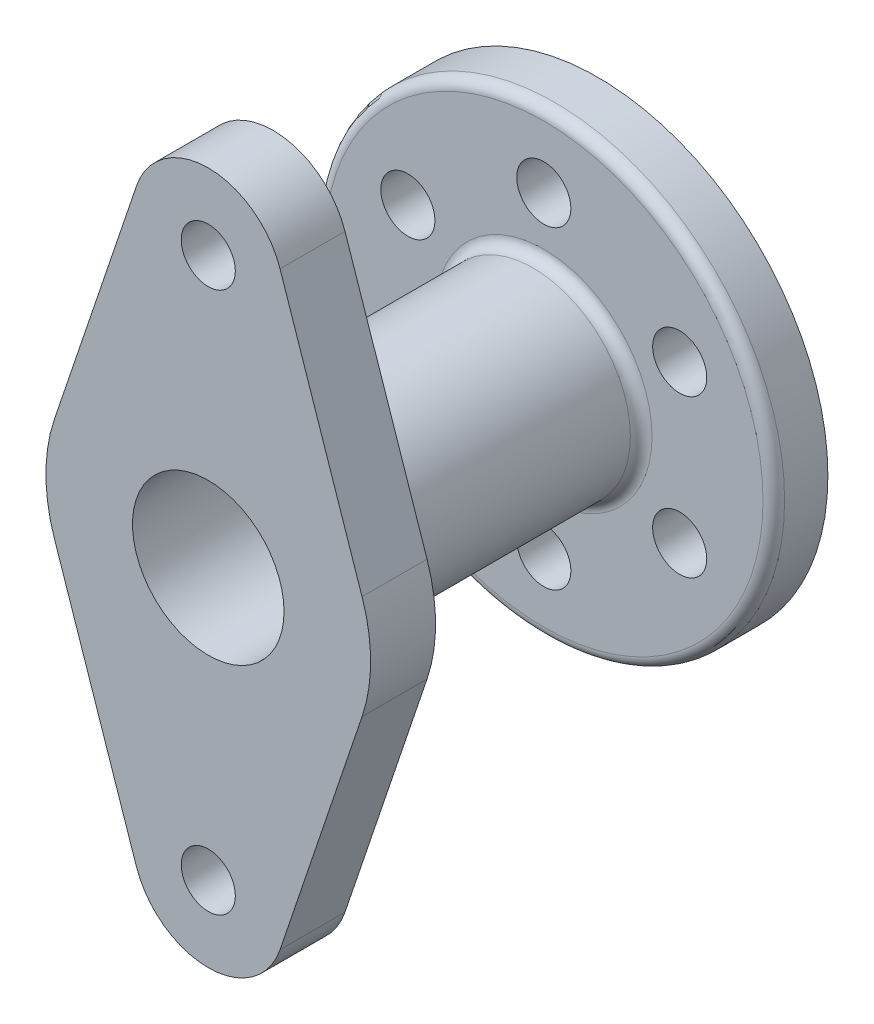
ISO-10303-21;
HEADER;
FILE_DESCRIPTION(('STEP AP214'),'2;1');
FILE_NAME('part.step','',(''),(''),'','','');
FILE_SCHEMA(('AUTOMOTIVE_DESIGN { 1 0 10303 214 1 1 1 1 }'));
ENDSEC;
DATA;
#1=APPLICATION_CONTEXT('core data for automotive mechanical design processes');
#2=APPLICATION_PROTOCOL_DEFINITION('international standard','automotive_design',2000,#1);
#3=PRODUCT_CONTEXT('',#1,'mechanical');
#4=PRODUCT('Part','Part','',(#3));
#5=PRODUCT_RELATED_PRODUCT_CATEGORY('part','',(#4));
#6=PRODUCT_DEFINITION_FORMATION('','',#4);
#7=PRODUCT_DEFINITION_CONTEXT('part definition',#1,'design');
#8=PRODUCT_DEFINITION('design','',#6,#7);
#9=PRODUCT_DEFINITION_SHAPE('','',#8);
#10=(LENGTH_UNIT() NAMED_UNIT(*) SI_UNIT(.MILLI.,.METRE.));
#11=(NAMED_UNIT(*) PLANE_ANGLE_UNIT() SI_UNIT($,.RADIAN.));
#12=(NAMED_UNIT(*) SI_UNIT($,.STERADIAN.) SOLID_ANGLE_UNIT());
#13=UNCERTAINTY_MEASURE_WITH_UNIT(LENGTH_MEASURE(1.E-05),#10,'distance_accuracy_value','');
#14=(GEOMETRIC_REPRESENTATION_CONTEXT(3) GLOBAL_UNCERTAINTY_ASSIGNED_CONTEXT((#13)) GLOBAL_UNIT_ASSIGNED_CONTEXT((#10,
#11,#12)) REPRESENTATION_CONTEXT('',''));
#15=CARTESIAN_POINT('',(0.,0.,0.));
#16=DIRECTION('',(0.,0.,1.));
#17=DIRECTION('',(1.,0.,0.));
#18=AXIS2_PLACEMENT_3D('',#15,#16,#17);
#19=CARTESIAN_POINT('',(0.,0.,10.));
#20=DIRECTION('',(0.,0.,-1.));
#21=DIRECTION('',(-1.,0.,0.));
#22=AXIS2_PLACEMENT_3D('',#19,#20,#21);
#23=CYLINDRICAL_SURFACE('',#22,42.5);
#24=CARTESIAN_POINT('',(0.,0.,8.));
#25=DIRECTION('',(0.,0.,1.));
#26=DIRECTION('',(1.,0.,0.));
#27=AXIS2_PLACEMENT_3D('',#24,#25,#26);
#28=CIRCLE('',#27,42.5);
#29=CARTESIAN_POINT('',(42.5,0.,8.));
#30=VERTEX_POINT('',#29);
#31=EDGE_CURVE('E49',#30,#30,#28,.F.);
#32=ORIENTED_EDGE('',*,*,#31,.T.);
#33=EDGE_LOOP('',(#32));
#34=FACE_BOUND('',#33,.T.);
#35=CARTESIAN_POINT('',(0.,0.,0.));
#36=DIRECTION('',(0.,0.,1.));
#37=DIRECTION('',(1.,0.,0.));
#38=AXIS2_PLACEMENT_3D('',#35,#36,#37);
#39=CIRCLE('',#38,42.5);
#40=CARTESIAN_POINT('',(42.5,0.,0.));
#41=VERTEX_POINT('',#40);
#42=EDGE_CURVE('E236',#41,#41,#39,.T.);
#43=ORIENTED_EDGE('',*,*,#42,.T.);
#44=EDGE_LOOP('',(#43));
#45=FACE_BOUND('',#44,.T.);
#46=ADVANCED_FACE('F39',(#34,#45),#23,.T.);
#47=CARTESIAN_POINT('',(0.,0.,10.));
#48=DIRECTION('',(0.,0.,1.));
#49=DIRECTION('',(1.,0.,0.));
#50=AXIS2_PLACEMENT_3D('',#47,#48,#49);
#51=PLANE('',#50);
#52=CARTESIAN_POINT('',(0.,0.,10.));
#53=DIRECTION('',(0.,0.,1.));
#54=DIRECTION('',(1.,0.,0.));
#55=AXIS2_PLACEMENT_3D('',#52,#53,#54);
#56=CIRCLE('',#55,40.5);
#57=CARTESIAN_POINT('',(40.5,0.,10.));
#58=VERTEX_POINT('',#57);
#59=EDGE_CURVE('E256',#58,#58,#56,.T.);
#60=ORIENTED_EDGE('',*,*,#59,.T.);
#61=EDGE_LOOP('',(#60));
#62=FACE_BOUND('',#61,.T.);
#63=CARTESIAN_POINT('',(0.,0.,10.));
#64=DIRECTION('',(0.,0.,1.));
#65=DIRECTION('',(1.,0.,0.));
#66=AXIS2_PLACEMENT_3D('',#63,#64,#65);
#67=CIRCLE('',#66,20.);
#68=CARTESIAN_POINT('',(20.,0.,10.));
#69=VERTEX_POINT('',#68);
#70=EDGE_CURVE('E243',#69,#69,#67,.F.);
#71=ORIENTED_EDGE('',*,*,#70,.T.);
#72=EDGE_LOOP('',(#71));
#73=FACE_BOUND('',#72,.T.);
#74=CARTESIAN_POINT('',(25.1147367097486,14.5000000000003,10.));
#75=DIRECTION('',(0.,0.,1.));
#76=DIRECTION('',(0.50000000000001,-0.866025403784433,0.));
#77=AXIS2_PLACEMENT_3D('',#74,#75,#76);
#78=CIRCLE('',#77,5.);
#79=CARTESIAN_POINT('',(27.6147367097486,10.1698729810781,10.));
#80=VERTEX_POINT('',#79);
#81=EDGE_CURVE('E191',#80,#80,#78,.T.);
#82=ORIENTED_EDGE('',*,*,#81,.F.);
#83=EDGE_LOOP('',(#82));
#84=FACE_BOUND('',#83,.T.);
#85=CARTESIAN_POINT('',(25.1147367097489,-14.4999999999998,10.));
#86=DIRECTION('',(0.,0.,1.));
#87=DIRECTION('',(-0.499999999999992,-0.866025403784443,0.));
#88=AXIS2_PLACEMENT_3D('',#85,#86,#87);
#89=CIRCLE('',#88,5.);
#90=CARTESIAN_POINT('',(22.6147367097489,-18.830127018922,10.));
#91=VERTEX_POINT('',#90);
#92=EDGE_CURVE('E213',#91,#91,#89,.T.);
#93=ORIENTED_EDGE('',*,*,#92,.F.);
#94=EDGE_LOOP('',(#93));
#95=FACE_BOUND('',#94,.T.);
#96=CARTESIAN_POINT('',(0.,-29.,10.));
#97=DIRECTION('',(0.,0.,1.));
#98=DIRECTION('',(-1.,0.,0.));
#99=AXIS2_PLACEMENT_3D('',#96,#97,#98);
#100=CIRCLE('',#99,5.);
#101=CARTESIAN_POINT('',(-5.,-29.,10.));
#102=VERTEX_POINT('',#101);
#103=EDGE_CURVE('E205',#102,#102,#100,.T.);
#104=ORIENTED_EDGE('',*,*,#103,.F.);
#105=EDGE_LOOP('',(#104));
#106=FACE_BOUND('',#105,.T.);
#107=CARTESIAN_POINT('',(-25.1147367097487,-14.5000000000001,10.));
#108=DIRECTION('',(0.,0.,1.));
#109=DIRECTION('',(-0.500000000000004,0.866025403784436,0.));
#110=AXIS2_PLACEMENT_3D('',#107,#108,#109);
#111=CIRCLE('',#110,5.);
#112=CARTESIAN_POINT('',(-27.6147367097487,-10.1698729810779,10.));
#113=VERTEX_POINT('',#112);
#114=EDGE_CURVE('E197',#113,#113,#111,.T.);
#115=ORIENTED_EDGE('',*,*,#114,.F.);
#116=EDGE_LOOP('',(#115));
#117=FACE_BOUND('',#116,.T.);
#118=CARTESIAN_POINT('',(-25.1147367097488,14.4999999999999,10.));
#119=DIRECTION('',(0.,0.,1.));
#120=DIRECTION('',(0.499999999999998,0.86602540378444,0.));
#121=AXIS2_PLACEMENT_3D('',#118,#119,#120);
#122=CIRCLE('',#121,5.);
#123=CARTESIAN_POINT('',(-22.6147367097488,18.8301270189221,10.));
#124=VERTEX_POINT('',#123);
#125=EDGE_CURVE('E196',#124,#124,#122,.T.);
#126=ORIENTED_EDGE('',*,*,#125,.F.);
#127=EDGE_LOOP('',(#126));
#128=FACE_BOUND('',#127,.T.);
#129=CARTESIAN_POINT('',(0.,29.,10.));
#130=DIRECTION('',(0.,0.,1.));
#131=DIRECTION('',(1.,0.,0.));
#132=AXIS2_PLACEMENT_3D('',#129,#130,#131);
#133=CIRCLE('',#132,5.);
#134=CARTESIAN_POINT('',(5.,29.,10.));
#135=VERTEX_POINT('',#134);
#136=EDGE_CURVE('E228',#135,#135,#133,.T.);
#137=ORIENTED_EDGE('',*,*,#136,.F.);
#138=EDGE_LOOP('',(#137));
#139=FACE_BOUND('',#138,.T.);
#140=ADVANCED_FACE('F271',(#62,#73,#84,#95,#106,#117,#128,#139),#51,.T.);
#141=CARTESIAN_POINT('',(0.,0.,0.));
#142=DIRECTION('',(0.,0.,1.));
#143=DIRECTION('',(1.,0.,0.));
#144=AXIS2_PLACEMENT_3D('',#141,#142,#143);
#145=PLANE('',#144);
#146=CARTESIAN_POINT('',(0.,0.,0.));
#147=DIRECTION('',(0.,0.,1.));
#148=DIRECTION('',(1.,0.,0.));
#149=AXIS2_PLACEMENT_3D('',#146,#147,#148);
#150=CIRCLE('',#149,9.99999999999998);
#151=CARTESIAN_POINT('',(9.99999999999998,0.,0.));
#152=VERTEX_POINT('',#151);
#153=EDGE_CURVE('E530',#152,#152,#150,.T.);
#154=ORIENTED_EDGE('',*,*,#153,.T.);
#155=EDGE_LOOP('',(#154));
#156=FACE_BOUND('',#155,.T.);
#157=CARTESIAN_POINT('',(25.1147367097486,14.5000000000003,0.));
#158=DIRECTION('',(0.,0.,1.));
#159=DIRECTION('',(0.50000000000001,-0.866025403784433,0.));
#160=AXIS2_PLACEMENT_3D('',#157,#158,#159);
#161=CIRCLE('',#160,5.);
#162=CARTESIAN_POINT('',(27.6147367097486,10.1698729810781,0.));
#163=VERTEX_POINT('',#162);
#164=EDGE_CURVE('E217',#163,#163,#161,.T.);
#165=ORIENTED_EDGE('',*,*,#164,.T.);
#166=EDGE_LOOP('',(#165));
#167=FACE_BOUND('',#166,.T.);
#168=CARTESIAN_POINT('',(25.1147367097489,-14.4999999999998,0.));
#169=DIRECTION('',(0.,0.,1.));
#170=DIRECTION('',(-0.499999999999992,-0.866025403784443,0.));
#171=AXIS2_PLACEMENT_3D('',#168,#169,#170);
#172=CIRCLE('',#171,5.);
#173=CARTESIAN_POINT('',(22.6147367097489,-18.830127018922,0.));
#174=VERTEX_POINT('',#173);
#175=EDGE_CURVE('E209',#174,#174,#172,.T.);
#176=ORIENTED_EDGE('',*,*,#175,.T.);
#177=EDGE_LOOP('',(#176));
#178=FACE_BOUND('',#177,.T.);
#179=CARTESIAN_POINT('',(0.,-29.,0.));
#180=DIRECTION('',(0.,0.,1.));
#181=DIRECTION('',(-1.,0.,0.));
#182=AXIS2_PLACEMENT_3D('',#179,#180,#181);
#183=CIRCLE('',#182,5.);
#184=CARTESIAN_POINT('',(-5.,-29.,0.));
#185=VERTEX_POINT('',#184);
#186=EDGE_CURVE('E201',#185,#185,#183,.T.);
#187=ORIENTED_EDGE('',*,*,#186,.T.);
#188=EDGE_LOOP('',(#187));
#189=FACE_BOUND('',#188,.T.);
#190=CARTESIAN_POINT('',(-25.1147367097487,-14.5000000000001,0.));
#191=DIRECTION('',(0.,0.,1.));
#192=DIRECTION('',(-0.500000000000004,0.866025403784436,0.));
#193=AXIS2_PLACEMENT_3D('',#190,#191,#192);
#194=CIRCLE('',#193,5.);
#195=CARTESIAN_POINT('',(-27.6147367097487,-10.1698729810779,0.));
#196=VERTEX_POINT('',#195);
#197=EDGE_CURVE('E192',#196,#196,#194,.T.);
#198=ORIENTED_EDGE('',*,*,#197,.T.);
#199=EDGE_LOOP('',(#198));
#200=FACE_BOUND('',#199,.T.);
#201=CARTESIAN_POINT('',(-25.1147367097488,14.4999999999999,0.));
#202=DIRECTION('',(0.,0.,1.));
#203=DIRECTION('',(0.499999999999998,0.86602540378444,0.));
#204=AXIS2_PLACEMENT_3D('',#201,#202,#203);
#205=CIRCLE('',#204,5.);
#206=CARTESIAN_POINT('',(-22.6147367097488,18.8301270189221,0.));
#207=VERTEX_POINT('',#206);
#208=EDGE_CURVE('E224',#207,#207,#205,.T.);
#209=ORIENTED_EDGE('',*,*,#208,.T.);
#210=EDGE_LOOP('',(#209));
#211=FACE_BOUND('',#210,.T.);
#212=CARTESIAN_POINT('',(0.,29.,0.));
#213=DIRECTION('',(0.,0.,1.));
#214=DIRECTION('',(1.,0.,0.));
#215=AXIS2_PLACEMENT_3D('',#212,#213,#214);
#216=CIRCLE('',#215,5.);
#217=CARTESIAN_POINT('',(5.,29.,0.));
#218=VERTEX_POINT('',#217);
#219=EDGE_CURVE('E232',#218,#218,#216,.T.);
#220=ORIENTED_EDGE('',*,*,#219,.T.);
#221=EDGE_LOOP('',(#220));
#222=FACE_BOUND('',#221,.T.);
#223=ORIENTED_EDGE('',*,*,#42,.F.);
#224=EDGE_LOOP('',(#223));
#225=FACE_BOUND('',#224,.T.);
#226=ADVANCED_FACE('F274',(#156,#167,#178,#189,#200,#211,#222,#225),#145,.F.);
#227=CARTESIAN_POINT('',(0.,29.,0.));
#228=DIRECTION('',(0.,0.,1.));
#229=DIRECTION('',(1.,0.,0.));
#230=AXIS2_PLACEMENT_3D('',#227,#228,#229);
#231=CYLINDRICAL_SURFACE('',#230,5.);
#232=ORIENTED_EDGE('',*,*,#219,.F.);
#233=EDGE_LOOP('',(#232));
#234=FACE_BOUND('',#233,.T.);
#235=ORIENTED_EDGE('',*,*,#136,.T.);
#236=EDGE_LOOP('',(#235));
#237=FACE_BOUND('',#236,.T.);
#238=ADVANCED_FACE('F290',(#234,#237),#231,.F.);
#239=CARTESIAN_POINT('',(-25.1147367097488,14.4999999999999,0.));
#240=DIRECTION('',(0.,0.,1.));
#241=DIRECTION('',(1.,0.,0.));
#242=AXIS2_PLACEMENT_3D('',#239,#240,#241);
#243=CYLINDRICAL_SURFACE('',#242,5.);
#244=ORIENTED_EDGE('',*,*,#208,.F.);
#245=EDGE_LOOP('',(#244));
#246=FACE_BOUND('',#245,.T.);
#247=ORIENTED_EDGE('',*,*,#125,.T.);
#248=EDGE_LOOP('',(#247));
#249=FACE_BOUND('',#248,.T.);
#250=ADVANCED_FACE('F292',(#246,#249),#243,.F.);
#251=CARTESIAN_POINT('',(-25.1147367097487,-14.5000000000001,0.));
#252=DIRECTION('',(0.,0.,1.));
#253=DIRECTION('',(1.,0.,0.));
#254=AXIS2_PLACEMENT_3D('',#251,#252,#253);
#255=CYLINDRICAL_SURFACE('',#254,5.);
#256=ORIENTED_EDGE('',*,*,#197,.F.);
#257=EDGE_LOOP('',(#256));
#258=FACE_BOUND('',#257,.T.);
#259=ORIENTED_EDGE('',*,*,#114,.T.);
#260=EDGE_LOOP('',(#259));
#261=FACE_BOUND('',#260,.T.);
#262=ADVANCED_FACE('F299',(#258,#261),#255,.F.);
#263=CARTESIAN_POINT('',(0.,-29.,0.));
#264=DIRECTION('',(0.,0.,1.));
#265=DIRECTION('',(1.,0.,0.));
#266=AXIS2_PLACEMENT_3D('',#263,#264,#265);
#267=CYLINDRICAL_SURFACE('',#266,5.);
#268=ORIENTED_EDGE('',*,*,#186,.F.);
#269=EDGE_LOOP('',(#268));
#270=FACE_BOUND('',#269,.T.);
#271=ORIENTED_EDGE('',*,*,#103,.T.);
#272=EDGE_LOOP('',(#271));
#273=FACE_BOUND('',#272,.T.);
#274=ADVANCED_FACE('F434',(#270,#273),#267,.F.);
#275=CARTESIAN_POINT('',(25.1147367097489,-14.4999999999998,0.));
#276=DIRECTION('',(0.,0.,1.));
#277=DIRECTION('',(1.,0.,0.));
#278=AXIS2_PLACEMENT_3D('',#275,#276,#277);
#279=CYLINDRICAL_SURFACE('',#278,5.);
#280=ORIENTED_EDGE('',*,*,#175,.F.);
#281=EDGE_LOOP('',(#280));
#282=FACE_BOUND('',#281,.T.);
#283=ORIENTED_EDGE('',*,*,#92,.T.);
#284=EDGE_LOOP('',(#283));
#285=FACE_BOUND('',#284,.T.);
#286=ADVANCED_FACE('F438',(#282,#285),#279,.F.);
#287=CARTESIAN_POINT('',(25.1147367097486,14.5000000000003,0.));
#288=DIRECTION('',(0.,0.,1.));
#289=DIRECTION('',(1.,0.,0.));
#290=AXIS2_PLACEMENT_3D('',#287,#288,#289);
#291=CYLINDRICAL_SURFACE('',#290,5.);
#292=ORIENTED_EDGE('',*,*,#164,.F.);
#293=EDGE_LOOP('',(#292));
#294=FACE_BOUND('',#293,.T.);
#295=ORIENTED_EDGE('',*,*,#81,.T.);
#296=EDGE_LOOP('',(#295));
#297=FACE_BOUND('',#296,.T.);
#298=ADVANCED_FACE('F394',(#294,#297),#291,.F.);
#299=CARTESIAN_POINT('',(0.,0.,60.));
#300=DIRECTION('',(0.,0.,-1.));
#301=DIRECTION('',(-1.,0.,0.));
#302=AXIS2_PLACEMENT_3D('',#299,#300,#301);
#303=CYLINDRICAL_SURFACE('',#302,18.);
#304=CARTESIAN_POINT('',(0.,0.,12.));
#305=DIRECTION('',(0.,0.,1.));
#306=DIRECTION('',(1.,0.,0.));
#307=AXIS2_PLACEMENT_3D('',#304,#305,#306);
#308=CIRCLE('',#307,18.);
#309=CARTESIAN_POINT('',(18.,0.,12.));
#310=VERTEX_POINT('',#309);
#311=EDGE_CURVE('E11',#310,#310,#308,.T.);
#312=ORIENTED_EDGE('',*,*,#311,.T.);
#313=EDGE_LOOP('',(#312));
#314=FACE_BOUND('',#313,.T.);
#315=CARTESIAN_POINT('',(0.,0.,60.));
#316=DIRECTION('',(0.,0.,1.));
#317=DIRECTION('',(1.,0.,0.));
#318=AXIS2_PLACEMENT_3D('',#315,#316,#317);
#319=CIRCLE('',#318,18.);
#320=CARTESIAN_POINT('',(18.,0.,60.));
#321=VERTEX_POINT('',#320);
#322=EDGE_CURVE('E187',#321,#321,#319,.T.);
#323=ORIENTED_EDGE('',*,*,#322,.F.);
#324=EDGE_LOOP('',(#323));
#325=FACE_BOUND('',#324,.T.);
#326=ADVANCED_FACE('F390',(#314,#325),#303,.T.);
#327=CARTESIAN_POINT('',(0.,50.,72.));
#328=DIRECTION('',(0.,0.,-1.));
#329=DIRECTION('',(-1.,0.,0.));
#330=AXIS2_PLACEMENT_3D('',#327,#328,#329);
#331=CYLINDRICAL_SURFACE('',#330,14.);
#332=CARTESIAN_POINT('',(0.,50.,60.));
#333=DIRECTION('',(0.,0.,1.));
#334=DIRECTION('',(1.,0.,0.));
#335=AXIS2_PLACEMENT_3D('',#332,#333,#334);
#336=CIRCLE('',#335,14.);
#337=CARTESIAN_POINT('',(13.2638455962063,54.48,60.));
#338=VERTEX_POINT('',#337);
#339=CARTESIAN_POINT('',(-13.2638455962063,54.48,60.));
#340=VERTEX_POINT('',#339);
#341=EDGE_CURVE('E142',#338,#340,#336,.T.);
#342=ORIENTED_EDGE('',*,*,#341,.T.);
#343=DIRECTION('',(0.,0.,-1.));
#344=VECTOR('',#343,1.);
#345=CARTESIAN_POINT('',(-13.2638455962063,54.48,72.));
#346=LINE('',#345,#344);
#347=CARTESIAN_POINT('',(-13.2638455962063,54.48,72.));
#348=VERTEX_POINT('',#347);
#349=EDGE_CURVE('E184',#348,#340,#346,.T.);
#350=ORIENTED_EDGE('',*,*,#349,.F.);
#351=CARTESIAN_POINT('',(0.,50.,72.));
#352=DIRECTION('',(0.,0.,1.));
#353=DIRECTION('',(1.,0.,0.));
#354=AXIS2_PLACEMENT_3D('',#351,#352,#353);
#355=CIRCLE('',#354,14.);
#356=CARTESIAN_POINT('',(13.2638455962063,54.48,72.));
#357=VERTEX_POINT('',#356);
#358=EDGE_CURVE('E165',#357,#348,#355,.T.);
#359=ORIENTED_EDGE('',*,*,#358,.F.);
#360=DIRECTION('',(0.,0.,-1.));
#361=VECTOR('',#360,1.);
#362=CARTESIAN_POINT('',(13.2638455962063,54.48,72.));
#363=LINE('',#362,#361);
#364=EDGE_CURVE('E138',#357,#338,#363,.T.);
#365=ORIENTED_EDGE('',*,*,#364,.T.);
#366=EDGE_LOOP('',(#342,#350,#359,#365));
#367=FACE_BOUND('',#366,.T.);
#368=ADVANCED_FACE('F393',(#367),#331,.T.);
#369=CARTESIAN_POINT('',(-13.2638455962063,54.48,72.));
#370=DIRECTION('',(0.947417542586161,-0.32,0.));
#371=DIRECTION('',(0.32,0.947417542586161,0.));
#372=AXIS2_PLACEMENT_3D('',#369,#370,#371);
#373=PLANE('',#372);
#374=DIRECTION('',(-0.32,-0.947417542586161,0.));
#375=VECTOR('',#374,1.);
#376=CARTESIAN_POINT('',(-13.2638455962063,54.48,60.));
#377=LINE('',#376,#375);
#378=CARTESIAN_POINT('',(-28.4225262775848,9.6,60.));
#379=VERTEX_POINT('',#378);
#380=EDGE_CURVE('E146',#340,#379,#377,.T.);
#381=ORIENTED_EDGE('',*,*,#380,.T.);
#382=DIRECTION('',(0.,0.,-1.));
#383=VECTOR('',#382,1.);
#384=CARTESIAN_POINT('',(-28.4225262775848,9.6,72.));
#385=LINE('',#384,#383);
#386=CARTESIAN_POINT('',(-28.4225262775848,9.6,72.));
#387=VERTEX_POINT('',#386);
#388=EDGE_CURVE('E180',#387,#379,#385,.T.);
#389=ORIENTED_EDGE('',*,*,#388,.F.);
#390=DIRECTION('',(-0.32,-0.947417542586161,0.));
#391=VECTOR('',#390,1.);
#392=CARTESIAN_POINT('',(-13.2638455962063,54.48,72.));
#393=LINE('',#392,#391);
#394=EDGE_CURVE('E101',#348,#387,#393,.T.);
#395=ORIENTED_EDGE('',*,*,#394,.F.);
#396=ORIENTED_EDGE('',*,*,#349,.T.);
#397=EDGE_LOOP('',(#381,#389,#395,#396));
#398=FACE_BOUND('',#397,.T.);
#399=ADVANCED_FACE('F426',(#398),#373,.F.);
#400=CARTESIAN_POINT('',(0.,0.,72.));
#401=DIRECTION('',(0.,0.,-1.));
#402=DIRECTION('',(-1.,0.,0.));
#403=AXIS2_PLACEMENT_3D('',#400,#401,#402);
#404=CYLINDRICAL_SURFACE('',#403,30.);
#405=CARTESIAN_POINT('',(0.,0.,60.));
#406=DIRECTION('',(0.,0.,1.));
#407=DIRECTION('',(1.,0.,0.));
#408=AXIS2_PLACEMENT_3D('',#405,#406,#407);
#409=CIRCLE('',#408,30.);
#410=CARTESIAN_POINT('',(-28.4225262775848,-9.59999999999999,60.));
#411=VERTEX_POINT('',#410);
#412=EDGE_CURVE('E150',#379,#411,#409,.T.);
#413=ORIENTED_EDGE('',*,*,#412,.T.);
#414=DIRECTION('',(0.,0.,-1.));
#415=VECTOR('',#414,1.);
#416=CARTESIAN_POINT('',(-28.4225262775848,-9.59999999999999,72.));
#417=LINE('',#416,#415);
#418=CARTESIAN_POINT('',(-28.4225262775848,-9.59999999999999,72.));
#419=VERTEX_POINT('',#418);
#420=EDGE_CURVE('E176',#419,#411,#417,.T.);
#421=ORIENTED_EDGE('',*,*,#420,.F.);
#422=CARTESIAN_POINT('',(0.,0.,72.));
#423=DIRECTION('',(0.,0.,1.));
#424=DIRECTION('',(1.,0.,0.));
#425=AXIS2_PLACEMENT_3D('',#422,#423,#424);
#426=CIRCLE('',#425,30.);
#427=EDGE_CURVE('E545',#387,#419,#426,.T.);
#428=ORIENTED_EDGE('',*,*,#427,.F.);
#429=ORIENTED_EDGE('',*,*,#388,.T.);
#430=EDGE_LOOP('',(#413,#421,#428,#429));
#431=FACE_BOUND('',#430,.T.);
#432=ADVANCED_FACE('F422',(#431),#404,.T.);
#433=CARTESIAN_POINT('',(-13.2638455962063,-54.48,72.));
#434=DIRECTION('',(0.947417542586161,0.32,0.));
#435=DIRECTION('',(-0.32,0.947417542586161,0.));
#436=AXIS2_PLACEMENT_3D('',#433,#434,#435);
#437=PLANE('',#436);
#438=DIRECTION('',(0.32,-0.947417542586161,0.));
#439=VECTOR('',#438,1.);
#440=CARTESIAN_POINT('',(-13.2638455962063,-54.48,60.));
#441=LINE('',#440,#439);
#442=CARTESIAN_POINT('',(-13.2638455962063,-54.48,60.));
#443=VERTEX_POINT('',#442);
#444=EDGE_CURVE('E153',#411,#443,#441,.T.);
#445=ORIENTED_EDGE('',*,*,#444,.T.);
#446=DIRECTION('',(0.,0.,-1.));
#447=VECTOR('',#446,1.);
#448=CARTESIAN_POINT('',(-13.2638455962063,-54.48,72.));
#449=LINE('',#448,#447);
#450=CARTESIAN_POINT('',(-13.2638455962063,-54.48,72.));
#451=VERTEX_POINT('',#450);
#452=EDGE_CURVE('E172',#451,#443,#449,.T.);
#453=ORIENTED_EDGE('',*,*,#452,.F.);
#454=DIRECTION('',(0.32,-0.947417542586161,0.));
#455=VECTOR('',#454,1.);
#456=CARTESIAN_POINT('',(-13.2638455962063,-54.48,72.));
#457=LINE('',#456,#455);
#458=EDGE_CURVE('E548',#419,#451,#457,.T.);
#459=ORIENTED_EDGE('',*,*,#458,.F.);
#460=ORIENTED_EDGE('',*,*,#420,.T.);
#461=EDGE_LOOP('',(#445,#453,#459,#460));
#462=FACE_BOUND('',#461,.T.);
#463=ADVANCED_FACE('F418',(#462),#437,.F.);
#464=CARTESIAN_POINT('',(0.,-50.,72.));
#465=DIRECTION('',(0.,0.,-1.));
#466=DIRECTION('',(-1.,0.,0.));
#467=AXIS2_PLACEMENT_3D('',#464,#465,#466);
#468=CYLINDRICAL_SURFACE('',#467,14.);
#469=CARTESIAN_POINT('',(0.,-50.,60.));
#470=DIRECTION('',(0.,0.,1.));
#471=DIRECTION('',(-1.,0.,0.));
#472=AXIS2_PLACEMENT_3D('',#469,#470,#471);
#473=CIRCLE('',#472,14.);
#474=CARTESIAN_POINT('',(13.2638455962063,-54.48,60.));
#475=VERTEX_POINT('',#474);
#476=EDGE_CURVE('E156',#443,#475,#473,.T.);
#477=ORIENTED_EDGE('',*,*,#476,.T.);
#478=DIRECTION('',(0.,0.,-1.));
#479=VECTOR('',#478,1.);
#480=CARTESIAN_POINT('',(13.2638455962063,-54.48,72.));
#481=LINE('',#480,#479);
#482=CARTESIAN_POINT('',(13.2638455962063,-54.48,72.));
#483=VERTEX_POINT('',#482);
#484=EDGE_CURVE('E131',#483,#475,#481,.T.);
#485=ORIENTED_EDGE('',*,*,#484,.F.);
#486=CARTESIAN_POINT('',(0.,-50.,72.));
#487=DIRECTION('',(0.,0.,1.));
#488=DIRECTION('',(-1.,0.,0.));
#489=AXIS2_PLACEMENT_3D('',#486,#487,#488);
#490=CIRCLE('',#489,14.);
#491=EDGE_CURVE('E120',#451,#483,#490,.T.);
#492=ORIENTED_EDGE('',*,*,#491,.F.);
#493=ORIENTED_EDGE('',*,*,#452,.T.);
#494=EDGE_LOOP('',(#477,#485,#492,#493));
#495=FACE_BOUND('',#494,.T.);
#496=ADVANCED_FACE('F415',(#495),#468,.T.);
#497=CARTESIAN_POINT('',(13.2638455962063,-54.48,72.));
#498=DIRECTION('',(-0.947417542586161,0.32,0.));
#499=DIRECTION('',(-0.32,-0.947417542586161,0.));
#500=AXIS2_PLACEMENT_3D('',#497,#498,#499);
#501=PLANE('',#500);
#502=DIRECTION('',(0.32,0.947417542586161,0.));
#503=VECTOR('',#502,1.);
#504=CARTESIAN_POINT('',(13.2638455962063,-54.48,60.));
#505=LINE('',#504,#503);
#506=CARTESIAN_POINT('',(28.4225262775848,-9.6,60.));
#507=VERTEX_POINT('',#506);
#508=EDGE_CURVE('E129',#475,#507,#505,.T.);
#509=ORIENTED_EDGE('',*,*,#508,.T.);
#510=DIRECTION('',(0.,0.,-1.));
#511=VECTOR('',#510,1.);
#512=CARTESIAN_POINT('',(28.4225262775848,-9.6,72.));
#513=LINE('',#512,#511);
#514=CARTESIAN_POINT('',(28.4225262775848,-9.6,72.));
#515=VERTEX_POINT('',#514);
#516=EDGE_CURVE('E126',#515,#507,#513,.T.);
#517=ORIENTED_EDGE('',*,*,#516,.F.);
#518=DIRECTION('',(0.32,0.947417542586161,0.));
#519=VECTOR('',#518,1.);
#520=CARTESIAN_POINT('',(13.2638455962063,-54.48,72.));
#521=LINE('',#520,#519);
#522=EDGE_CURVE('E114',#483,#515,#521,.T.);
#523=ORIENTED_EDGE('',*,*,#522,.F.);
#524=ORIENTED_EDGE('',*,*,#484,.T.);
#525=EDGE_LOOP('',(#509,#517,#523,#524));
#526=FACE_BOUND('',#525,.T.);
#527=ADVANCED_FACE('F127',(#526),#501,.F.);
#528=CARTESIAN_POINT('',(0.,0.,72.));
#529=DIRECTION('',(0.,0.,-1.));
#530=DIRECTION('',(-1.,0.,0.));
#531=AXIS2_PLACEMENT_3D('',#528,#529,#530);
#532=CYLINDRICAL_SURFACE('',#531,30.);
#533=CARTESIAN_POINT('',(0.,0.,60.));
#534=DIRECTION('',(0.,0.,1.));
#535=DIRECTION('',(1.,0.,0.));
#536=AXIS2_PLACEMENT_3D('',#533,#534,#535);
#537=CIRCLE('',#536,30.);
#538=CARTESIAN_POINT('',(28.4225262775848,9.6,60.));
#539=VERTEX_POINT('',#538);
#540=EDGE_CURVE('E86',#507,#539,#537,.T.);
#541=ORIENTED_EDGE('',*,*,#540,.T.);
#542=DIRECTION('',(0.,0.,-1.));
#543=VECTOR('',#542,1.);
#544=CARTESIAN_POINT('',(28.4225262775848,9.6,72.));
#545=LINE('',#544,#543);
#546=CARTESIAN_POINT('',(28.4225262775848,9.6,72.));
#547=VERTEX_POINT('',#546);
#548=EDGE_CURVE('E132',#547,#539,#545,.T.);
#549=ORIENTED_EDGE('',*,*,#548,.F.);
#550=CARTESIAN_POINT('',(0.,0.,72.));
#551=DIRECTION('',(0.,0.,1.));
#552=DIRECTION('',(1.,0.,0.));
#553=AXIS2_PLACEMENT_3D('',#550,#551,#552);
#554=CIRCLE('',#553,30.);
#555=EDGE_CURVE('E118',#515,#547,#554,.T.);
#556=ORIENTED_EDGE('',*,*,#555,.F.);
#557=ORIENTED_EDGE('',*,*,#516,.T.);
#558=EDGE_LOOP('',(#541,#549,#556,#557));
#559=FACE_BOUND('',#558,.T.);
#560=ADVANCED_FACE('F134',(#559),#532,.T.);
#561=CARTESIAN_POINT('',(13.2638455962063,54.48,72.));
#562=DIRECTION('',(-0.947417542586161,-0.32,0.));
#563=DIRECTION('',(0.32,-0.947417542586161,0.));
#564=AXIS2_PLACEMENT_3D('',#561,#562,#563);
#565=PLANE('',#564);
#566=DIRECTION('',(-0.32,0.947417542586161,0.));
#567=VECTOR('',#566,1.);
#568=CARTESIAN_POINT('',(13.2638455962063,54.48,60.));
#569=LINE('',#568,#567);
#570=EDGE_CURVE('E92',#539,#338,#569,.T.);
#571=ORIENTED_EDGE('',*,*,#570,.T.);
#572=ORIENTED_EDGE('',*,*,#364,.F.);
#573=DIRECTION('',(-0.32,0.947417542586161,0.));
#574=VECTOR('',#573,1.);
#575=CARTESIAN_POINT('',(13.2638455962063,54.48,72.));
#576=LINE('',#575,#574);
#577=EDGE_CURVE('E57',#547,#357,#576,.T.);
#578=ORIENTED_EDGE('',*,*,#577,.F.);
#579=ORIENTED_EDGE('',*,*,#548,.T.);
#580=EDGE_LOOP('',(#571,#572,#578,#579));
#581=FACE_BOUND('',#580,.T.);
#582=ADVANCED_FACE('F336',(#581),#565,.F.);
#583=CARTESIAN_POINT('',(0.,50.,72.));
#584=DIRECTION('',(0.,0.,1.));
#585=DIRECTION('',(1.,0.,0.));
#586=AXIS2_PLACEMENT_3D('',#583,#584,#585);
#587=PLANE('',#586);
#588=CARTESIAN_POINT('',(0.,0.,72.));
#589=DIRECTION('',(0.,0.,1.));
#590=DIRECTION('',(1.,0.,0.));
#591=AXIS2_PLACEMENT_3D('',#588,#589,#590);
#592=CIRCLE('',#591,14.);
#593=CARTESIAN_POINT('',(14.,0.,72.));
#594=VERTEX_POINT('',#593);
#595=EDGE_CURVE('E566',#594,#594,#592,.T.);
#596=ORIENTED_EDGE('',*,*,#595,.F.);
#597=EDGE_LOOP('',(#596));
#598=FACE_BOUND('',#597,.T.);
#599=CARTESIAN_POINT('',(0.,-50.,72.));
#600=DIRECTION('',(0.,0.,-1.));
#601=DIRECTION('',(1.,0.,0.));
#602=AXIS2_PLACEMENT_3D('',#599,#600,#601);
#603=CIRCLE('',#602,5.);
#604=CARTESIAN_POINT('',(5.,-50.,72.));
#605=VERTEX_POINT('',#604);
#606=EDGE_CURVE('E252',#605,#605,#603,.T.);
#607=ORIENTED_EDGE('',*,*,#606,.T.);
#608=EDGE_LOOP('',(#607));
#609=FACE_BOUND('',#608,.T.);
#610=CARTESIAN_POINT('',(0.,50.,72.));
#611=DIRECTION('',(0.,0.,1.));
#612=DIRECTION('',(1.,0.,0.));
#613=AXIS2_PLACEMENT_3D('',#610,#611,#612);
#614=CIRCLE('',#613,5.);
#615=CARTESIAN_POINT('',(5.,50.,72.));
#616=VERTEX_POINT('',#615);
#617=EDGE_CURVE('E247',#616,#616,#614,.T.);
#618=ORIENTED_EDGE('',*,*,#617,.F.);
#619=EDGE_LOOP('',(#618));
#620=FACE_BOUND('',#619,.T.);
#621=ORIENTED_EDGE('',*,*,#358,.T.);
#622=ORIENTED_EDGE('',*,*,#394,.T.);
#623=ORIENTED_EDGE('',*,*,#427,.T.);
#624=ORIENTED_EDGE('',*,*,#458,.T.);
#625=ORIENTED_EDGE('',*,*,#491,.T.);
#626=ORIENTED_EDGE('',*,*,#522,.T.);
#627=ORIENTED_EDGE('',*,*,#555,.T.);
#628=ORIENTED_EDGE('',*,*,#577,.T.);
#629=EDGE_LOOP('',(#621,#622,#623,#624,#625,#626,#627,#628));
#630=FACE_BOUND('',#629,.T.);
#631=ADVANCED_FACE('F116',(#598,#609,#620,#630),#587,.T.);
#632=CARTESIAN_POINT('',(0.,50.,60.));
#633=DIRECTION('',(0.,0.,1.));
#634=DIRECTION('',(1.,0.,0.));
#635=AXIS2_PLACEMENT_3D('',#632,#633,#634);
#636=PLANE('',#635);
#637=CARTESIAN_POINT('',(0.,-50.,60.));
#638=DIRECTION('',(0.,0.,1.));
#639=DIRECTION('',(1.,0.,0.));
#640=AXIS2_PLACEMENT_3D('',#637,#638,#639);
#641=CIRCLE('',#640,5.);
#642=CARTESIAN_POINT('',(5.,-50.,60.));
#643=VERTEX_POINT('',#642);
#644=EDGE_CURVE('E248',#643,#643,#641,.F.);
#645=ORIENTED_EDGE('',*,*,#644,.F.);
#646=EDGE_LOOP('',(#645));
#647=FACE_BOUND('',#646,.T.);
#648=CARTESIAN_POINT('',(0.,50.,60.));
#649=DIRECTION('',(0.,0.,1.));
#650=DIRECTION('',(1.,0.,0.));
#651=AXIS2_PLACEMENT_3D('',#648,#649,#650);
#652=CIRCLE('',#651,5.);
#653=CARTESIAN_POINT('',(5.,50.,60.));
#654=VERTEX_POINT('',#653);
#655=EDGE_CURVE('E147',#654,#654,#652,.T.);
#656=ORIENTED_EDGE('',*,*,#655,.T.);
#657=EDGE_LOOP('',(#656));
#658=FACE_BOUND('',#657,.T.);
#659=ORIENTED_EDGE('',*,*,#322,.T.);
#660=EDGE_LOOP('',(#659));
#661=FACE_BOUND('',#660,.T.);
#662=ORIENTED_EDGE('',*,*,#341,.F.);
#663=ORIENTED_EDGE('',*,*,#570,.F.);
#664=ORIENTED_EDGE('',*,*,#540,.F.);
#665=ORIENTED_EDGE('',*,*,#508,.F.);
#666=ORIENTED_EDGE('',*,*,#476,.F.);
#667=ORIENTED_EDGE('',*,*,#444,.F.);
#668=ORIENTED_EDGE('',*,*,#412,.F.);
#669=ORIENTED_EDGE('',*,*,#380,.F.);
#670=EDGE_LOOP('',(#662,#663,#664,#665,#666,#667,#668,#669));
#671=FACE_BOUND('',#670,.T.);
#672=ADVANCED_FACE('F335',(#647,#658,#661,#671),#636,.F.);
#673=CARTESIAN_POINT('',(0.,50.,0.));
#674=DIRECTION('',(0.,0.,1.));
#675=DIRECTION('',(1.,0.,0.));
#676=AXIS2_PLACEMENT_3D('',#673,#674,#675);
#677=CYLINDRICAL_SURFACE('',#676,5.);
#678=ORIENTED_EDGE('',*,*,#617,.T.);
#679=EDGE_LOOP('',(#678));
#680=FACE_BOUND('',#679,.T.);
#681=ORIENTED_EDGE('',*,*,#655,.F.);
#682=EDGE_LOOP('',(#681));
#683=FACE_BOUND('',#682,.T.);
#684=ADVANCED_FACE('F399',(#680,#683),#677,.F.);
#685=CARTESIAN_POINT('',(0.,-50.,0.));
#686=DIRECTION('',(0.,0.,1.));
#687=DIRECTION('',(1.,0.,0.));
#688=AXIS2_PLACEMENT_3D('',#685,#686,#687);
#689=CYLINDRICAL_SURFACE('',#688,5.);
#690=ORIENTED_EDGE('',*,*,#606,.F.);
#691=EDGE_LOOP('',(#690));
#692=FACE_BOUND('',#691,.T.);
#693=ORIENTED_EDGE('',*,*,#644,.T.);
#694=EDGE_LOOP('',(#693));
#695=FACE_BOUND('',#694,.T.);
#696=ADVANCED_FACE('F326',(#692,#695),#689,.F.);
#697=CARTESIAN_POINT('',(0.,0.,72.));
#698=DIRECTION('',(0.,0.,1.));
#699=DIRECTION('',(1.,0.,0.));
#700=AXIS2_PLACEMENT_3D('',#697,#698,#699);
#701=CYLINDRICAL_SURFACE('',#700,9.99999999999999);
#702=ORIENTED_EDGE('',*,*,#153,.F.);
#703=EDGE_LOOP('',(#702));
#704=FACE_BOUND('',#703,.T.);
#705=CARTESIAN_POINT('',(0.,0.,47.));
#706=DIRECTION('',(0.,0.,1.));
#707=DIRECTION('',(1.,0.,0.));
#708=AXIS2_PLACEMENT_3D('',#705,#706,#707);
#709=CIRCLE('',#708,9.99999999999999);
#710=CARTESIAN_POINT('',(9.99999999999999,0.,47.));
#711=VERTEX_POINT('',#710);
#712=EDGE_CURVE('E534',#711,#711,#709,.T.);
#713=ORIENTED_EDGE('',*,*,#712,.T.);
#714=EDGE_LOOP('',(#713));
#715=FACE_BOUND('',#714,.T.);
#716=ADVANCED_FACE('F346',(#704,#715),#701,.F.);
#717=CARTESIAN_POINT('',(9.99999999999999,0.,47.));
#718=DIRECTION('',(0.,0.,-1.));
#719=DIRECTION('',(-1.,0.,0.));
#720=AXIS2_PLACEMENT_3D('',#717,#718,#719);
#721=PLANE('',#720);
#722=ORIENTED_EDGE('',*,*,#712,.F.);
#723=EDGE_LOOP('',(#722));
#724=FACE_BOUND('',#723,.T.);
#725=CARTESIAN_POINT('',(0.,0.,47.));
#726=DIRECTION('',(0.,0.,1.));
#727=DIRECTION('',(1.,0.,0.));
#728=AXIS2_PLACEMENT_3D('',#725,#726,#727);
#729=CIRCLE('',#728,14.);
#730=CARTESIAN_POINT('',(14.,0.,47.));
#731=VERTEX_POINT('',#730);
#732=EDGE_CURVE('E562',#731,#731,#729,.T.);
#733=ORIENTED_EDGE('',*,*,#732,.T.);
#734=EDGE_LOOP('',(#733));
#735=FACE_BOUND('',#734,.T.);
#736=ADVANCED_FACE('F351',(#724,#735),#721,.F.);
#737=CARTESIAN_POINT('',(0.,0.,72.));
#738=DIRECTION('',(0.,0.,1.));
#739=DIRECTION('',(1.,0.,0.));
#740=AXIS2_PLACEMENT_3D('',#737,#738,#739);
#741=CYLINDRICAL_SURFACE('',#740,14.);
#742=ORIENTED_EDGE('',*,*,#732,.F.);
#743=EDGE_LOOP('',(#742));
#744=FACE_BOUND('',#743,.T.);
#745=ORIENTED_EDGE('',*,*,#595,.T.);
#746=EDGE_LOOP('',(#745));
#747=FACE_BOUND('',#746,.T.);
#748=ADVANCED_FACE('F268',(#744,#747),#741,.F.);
#749=CARTESIAN_POINT('',(0.,0.,8.));
#750=DIRECTION('',(0.,0.,1.));
#751=DIRECTION('',(1.,0.,0.));
#752=AXIS2_PLACEMENT_3D('',#749,#750,#751);
#753=TOROIDAL_SURFACE('',#752,40.5,2.);
#754=ORIENTED_EDGE('',*,*,#31,.F.);
#755=EDGE_LOOP('',(#754));
#756=FACE_BOUND('',#755,.T.);
#757=ORIENTED_EDGE('',*,*,#59,.F.);
#758=EDGE_LOOP('',(#757));
#759=FACE_BOUND('',#758,.T.);
#760=ADVANCED_FACE('F265',(#756,#759),#753,.T.);
#761=CARTESIAN_POINT('',(0.,0.,12.));
#762=DIRECTION('',(0.,0.,1.));
#763=DIRECTION('',(1.,0.,0.));
#764=AXIS2_PLACEMENT_3D('',#761,#762,#763);
#765=TOROIDAL_SURFACE('',#764,20.,2.);
#766=ORIENTED_EDGE('',*,*,#70,.F.);
#767=EDGE_LOOP('',(#766));
#768=FACE_BOUND('',#767,.T.);
#769=ORIENTED_EDGE('',*,*,#311,.F.);
#770=EDGE_LOOP('',(#769));
#771=FACE_BOUND('',#770,.T.);
#772=ADVANCED_FACE('F41',(#768,#771),#765,.F.);
#773=CLOSED_SHELL('',(#46,#140,#226,#238,#250,#262,#274,#286,#298,#326,#368,#399,#432,#463,#496,
#527,#560,#582,#631,#672,#684,#696,#716,#736,#748,#760,#772));
#774=MANIFOLD_SOLID_BREP('B2',#773);
#775=ADVANCED_BREP_SHAPE_REPRESENTATION('',(#18,#774),#14);
#776=SHAPE_DEFINITION_REPRESENTATION(#9,#775);
ENDSEC;
END-ISO-10303-21;
